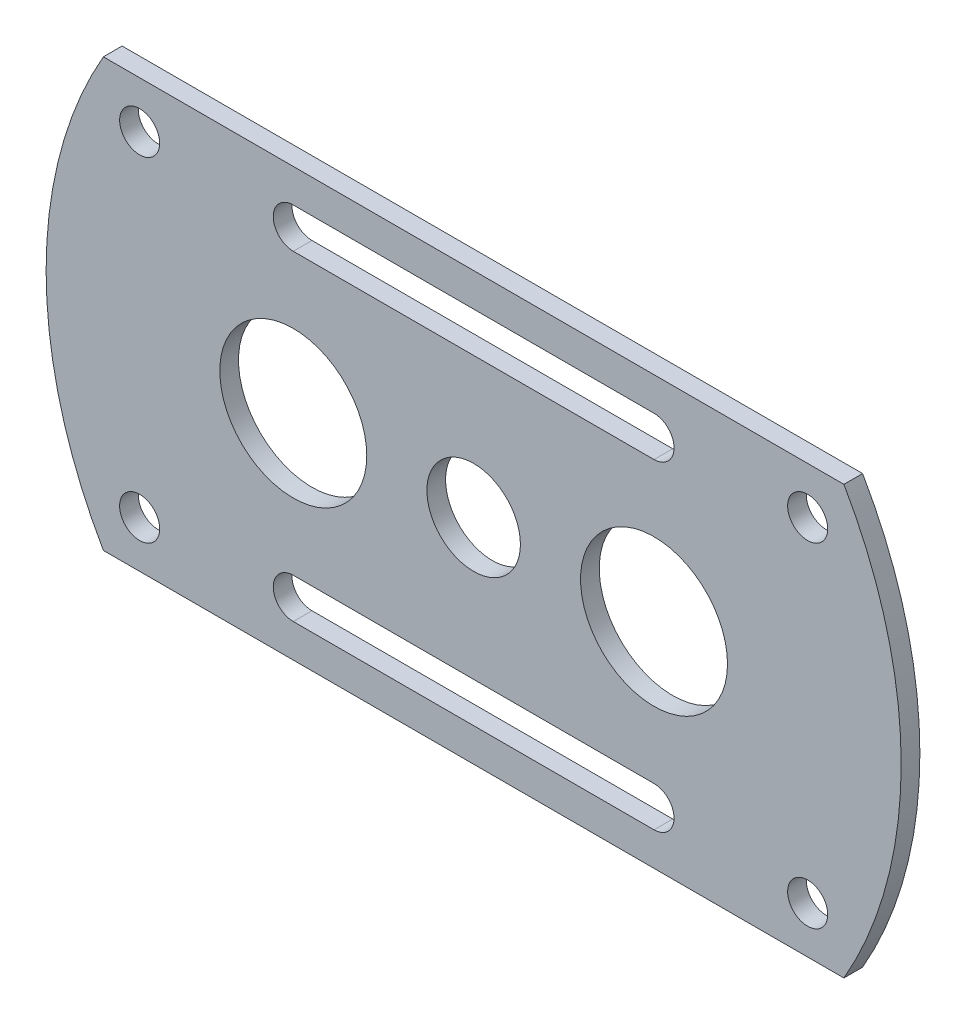
ISO-10303-21;
HEADER;
FILE_DESCRIPTION(('STEP AP214'),'2;1');
FILE_NAME('part.step','',(''),(''),'','','');
FILE_SCHEMA(('AUTOMOTIVE_DESIGN { 1 0 10303 214 1 1 1 1 }'));
ENDSEC;
DATA;
#1=APPLICATION_CONTEXT('core data for automotive mechanical design processes');
#2=APPLICATION_PROTOCOL_DEFINITION('international standard','automotive_design',2000,#1);
#3=PRODUCT_CONTEXT('',#1,'mechanical');
#4=PRODUCT('Part','Part','',(#3));
#5=PRODUCT_RELATED_PRODUCT_CATEGORY('part','',(#4));
#6=PRODUCT_DEFINITION_FORMATION('','',#4);
#7=PRODUCT_DEFINITION_CONTEXT('part definition',#1,'design');
#8=PRODUCT_DEFINITION('design','',#6,#7);
#9=PRODUCT_DEFINITION_SHAPE('','',#8);
#10=(LENGTH_UNIT() NAMED_UNIT(*) SI_UNIT(.MILLI.,.METRE.));
#11=(NAMED_UNIT(*) PLANE_ANGLE_UNIT() SI_UNIT($,.RADIAN.));
#12=(NAMED_UNIT(*) SI_UNIT($,.STERADIAN.) SOLID_ANGLE_UNIT());
#13=UNCERTAINTY_MEASURE_WITH_UNIT(LENGTH_MEASURE(1.E-05),#10,'distance_accuracy_value','');
#14=(GEOMETRIC_REPRESENTATION_CONTEXT(3) GLOBAL_UNCERTAINTY_ASSIGNED_CONTEXT((#13)) GLOBAL_UNIT_ASSIGNED_CONTEXT((#10,
#11,#12)) REPRESENTATION_CONTEXT('',''));
#15=CARTESIAN_POINT('',(0.,0.,0.));
#16=DIRECTION('',(0.,0.,1.));
#17=DIRECTION('',(1.,0.,0.));
#18=AXIS2_PLACEMENT_3D('',#15,#16,#17);
#19=CARTESIAN_POINT('',(0.,0.,1.4));
#20=DIRECTION('',(0.,0.,1.));
#21=DIRECTION('',(1.,0.,0.));
#22=AXIS2_PLACEMENT_3D('',#19,#20,#21);
#23=PLANE('',#22);
#24=CARTESIAN_POINT('',(-25.,12.5,1.4));
#25=DIRECTION('',(0.,0.,1.));
#26=DIRECTION('',(1.,0.,0.));
#27=AXIS2_PLACEMENT_3D('',#24,#25,#26);
#28=CIRCLE('',#27,1.5);
#29=CARTESIAN_POINT('',(-23.5,12.5,1.4));
#30=VERTEX_POINT('',#29);
#31=EDGE_CURVE('E202',#30,#30,#28,.F.);
#32=ORIENTED_EDGE('',*,*,#31,.T.);
#33=EDGE_LOOP('',(#32));
#34=FACE_BOUND('',#33,.T.);
#35=CARTESIAN_POINT('',(25.,12.5,1.4));
#36=DIRECTION('',(0.,0.,1.));
#37=DIRECTION('',(1.,0.,0.));
#38=AXIS2_PLACEMENT_3D('',#35,#36,#37);
#39=CIRCLE('',#38,1.5);
#40=CARTESIAN_POINT('',(26.5,12.5,1.4));
#41=VERTEX_POINT('',#40);
#42=EDGE_CURVE('E205',#41,#41,#39,.F.);
#43=ORIENTED_EDGE('',*,*,#42,.T.);
#44=EDGE_LOOP('',(#43));
#45=FACE_BOUND('',#44,.T.);
#46=CARTESIAN_POINT('',(-25.,-12.5,1.4));
#47=DIRECTION('',(0.,0.,1.));
#48=DIRECTION('',(1.,0.,0.));
#49=AXIS2_PLACEMENT_3D('',#46,#47,#48);
#50=CIRCLE('',#49,1.5);
#51=CARTESIAN_POINT('',(-23.5,-12.5,1.4));
#52=VERTEX_POINT('',#51);
#53=EDGE_CURVE('E210',#52,#52,#50,.F.);
#54=ORIENTED_EDGE('',*,*,#53,.T.);
#55=EDGE_LOOP('',(#54));
#56=FACE_BOUND('',#55,.T.);
#57=CARTESIAN_POINT('',(25.,-12.5,1.4));
#58=DIRECTION('',(0.,0.,1.));
#59=DIRECTION('',(1.,0.,0.));
#60=AXIS2_PLACEMENT_3D('',#57,#58,#59);
#61=CIRCLE('',#60,1.5);
#62=CARTESIAN_POINT('',(26.5,-12.5,1.4));
#63=VERTEX_POINT('',#62);
#64=EDGE_CURVE('E215',#63,#63,#61,.F.);
#65=ORIENTED_EDGE('',*,*,#64,.T.);
#66=EDGE_LOOP('',(#65));
#67=FACE_BOUND('',#66,.T.);
#68=CARTESIAN_POINT('',(0.,0.,1.4));
#69=DIRECTION('',(0.,0.,1.));
#70=DIRECTION('',(1.,0.,0.));
#71=AXIS2_PLACEMENT_3D('',#68,#69,#70);
#72=CIRCLE('',#71,3.5);
#73=CARTESIAN_POINT('',(3.5,0.,1.4));
#74=VERTEX_POINT('',#73);
#75=EDGE_CURVE('E220',#74,#74,#72,.F.);
#76=ORIENTED_EDGE('',*,*,#75,.T.);
#77=EDGE_LOOP('',(#76));
#78=FACE_BOUND('',#77,.T.);
#79=CARTESIAN_POINT('',(-13.5,0.,1.4));
#80=DIRECTION('',(0.,0.,1.));
#81=DIRECTION('',(1.,0.,0.));
#82=AXIS2_PLACEMENT_3D('',#79,#80,#81);
#83=CIRCLE('',#82,5.5);
#84=CARTESIAN_POINT('',(-8.,0.,1.4));
#85=VERTEX_POINT('',#84);
#86=EDGE_CURVE('E225',#85,#85,#83,.F.);
#87=ORIENTED_EDGE('',*,*,#86,.T.);
#88=EDGE_LOOP('',(#87));
#89=FACE_BOUND('',#88,.T.);
#90=CARTESIAN_POINT('',(13.5,0.,1.4));
#91=DIRECTION('',(0.,0.,1.));
#92=DIRECTION('',(1.,0.,0.));
#93=AXIS2_PLACEMENT_3D('',#90,#91,#92);
#94=CIRCLE('',#93,5.5);
#95=CARTESIAN_POINT('',(19.,0.,1.4));
#96=VERTEX_POINT('',#95);
#97=EDGE_CURVE('E135',#96,#96,#94,.F.);
#98=ORIENTED_EDGE('',*,*,#97,.T.);
#99=EDGE_LOOP('',(#98));
#100=FACE_BOUND('',#99,.T.);
#101=DIRECTION('',(-1.,0.,0.));
#102=VECTOR('',#101,1.);
#103=CARTESIAN_POINT('',(13.5,13.5,1.4));
#104=LINE('',#103,#102);
#105=CARTESIAN_POINT('',(-13.5,13.5,1.4));
#106=VERTEX_POINT('',#105);
#107=CARTESIAN_POINT('',(13.5,13.5,1.4));
#108=VERTEX_POINT('',#107);
#109=EDGE_CURVE('E136',#106,#108,#104,.F.);
#110=ORIENTED_EDGE('',*,*,#109,.T.);
#111=CARTESIAN_POINT('',(13.5,12.,1.4));
#112=DIRECTION('',(0.,0.,1.));
#113=DIRECTION('',(1.,0.,0.));
#114=AXIS2_PLACEMENT_3D('',#111,#112,#113);
#115=CIRCLE('',#114,1.5);
#116=CARTESIAN_POINT('',(13.5,10.5,1.4));
#117=VERTEX_POINT('',#116);
#118=EDGE_CURVE('E236',#108,#117,#115,.F.);
#119=ORIENTED_EDGE('',*,*,#118,.T.);
#120=DIRECTION('',(1.,0.,0.));
#121=VECTOR('',#120,1.);
#122=CARTESIAN_POINT('',(-13.5,10.5,1.4));
#123=LINE('',#122,#121);
#124=CARTESIAN_POINT('',(-13.5,10.5,1.4));
#125=VERTEX_POINT('',#124);
#126=EDGE_CURVE('E132',#117,#125,#123,.F.);
#127=ORIENTED_EDGE('',*,*,#126,.T.);
#128=CARTESIAN_POINT('',(-13.5,12.,1.4));
#129=DIRECTION('',(0.,0.,1.));
#130=DIRECTION('',(1.,0.,0.));
#131=AXIS2_PLACEMENT_3D('',#128,#129,#130);
#132=CIRCLE('',#131,1.5);
#133=EDGE_CURVE('E143',#125,#106,#132,.F.);
#134=ORIENTED_EDGE('',*,*,#133,.T.);
#135=EDGE_LOOP('',(#110,#119,#127,#134));
#136=FACE_BOUND('',#135,.T.);
#137=DIRECTION('',(1.,0.,0.));
#138=VECTOR('',#137,1.);
#139=CARTESIAN_POINT('',(-13.5,-13.5,1.4));
#140=LINE('',#139,#138);
#141=CARTESIAN_POINT('',(13.5,-13.5,1.4));
#142=VERTEX_POINT('',#141);
#143=CARTESIAN_POINT('',(-13.5,-13.5,1.4));
#144=VERTEX_POINT('',#143);
#145=EDGE_CURVE('E145',#142,#144,#140,.F.);
#146=ORIENTED_EDGE('',*,*,#145,.T.);
#147=CARTESIAN_POINT('',(-13.5,-12.,1.4));
#148=DIRECTION('',(0.,0.,1.));
#149=DIRECTION('',(1.,0.,0.));
#150=AXIS2_PLACEMENT_3D('',#147,#148,#149);
#151=CIRCLE('',#150,1.5);
#152=CARTESIAN_POINT('',(-13.5,-10.5,1.4));
#153=VERTEX_POINT('',#152);
#154=EDGE_CURVE('E240',#144,#153,#151,.F.);
#155=ORIENTED_EDGE('',*,*,#154,.T.);
#156=DIRECTION('',(-1.,0.,0.));
#157=VECTOR('',#156,1.);
#158=CARTESIAN_POINT('',(13.5,-10.5,1.4));
#159=LINE('',#158,#157);
#160=CARTESIAN_POINT('',(13.5,-10.5,1.4));
#161=VERTEX_POINT('',#160);
#162=EDGE_CURVE('E140',#153,#161,#159,.F.);
#163=ORIENTED_EDGE('',*,*,#162,.T.);
#164=CARTESIAN_POINT('',(13.5,-12.,1.4));
#165=DIRECTION('',(0.,0.,1.));
#166=DIRECTION('',(1.,0.,0.));
#167=AXIS2_PLACEMENT_3D('',#164,#165,#166);
#168=CIRCLE('',#167,1.5);
#169=EDGE_CURVE('E243',#161,#142,#168,.F.);
#170=ORIENTED_EDGE('',*,*,#169,.T.);
#171=EDGE_LOOP('',(#146,#155,#163,#170));
#172=FACE_BOUND('',#171,.T.);
#173=DIRECTION('',(1.,0.,0.));
#174=VECTOR('',#173,1.);
#175=CARTESIAN_POINT('',(-27.712812921102,-16.,1.4));
#176=LINE('',#175,#174);
#177=CARTESIAN_POINT('',(27.712812921102,-16.,1.4));
#178=VERTEX_POINT('',#177);
#179=CARTESIAN_POINT('',(-27.712812921102,-16.,1.4));
#180=VERTEX_POINT('',#179);
#181=EDGE_CURVE('E104',#178,#180,#176,.F.);
#182=ORIENTED_EDGE('',*,*,#181,.F.);
#183=CARTESIAN_POINT('',(0.,0.,1.4));
#184=DIRECTION('',(0.,0.,1.));
#185=DIRECTION('',(1.,0.,0.));
#186=AXIS2_PLACEMENT_3D('',#183,#184,#185);
#187=CIRCLE('',#186,32.);
#188=CARTESIAN_POINT('',(27.712812921102,16.,1.4));
#189=VERTEX_POINT('',#188);
#190=EDGE_CURVE('E119',#189,#178,#187,.F.);
#191=ORIENTED_EDGE('',*,*,#190,.F.);
#192=DIRECTION('',(-1.,0.,0.));
#193=VECTOR('',#192,1.);
#194=CARTESIAN_POINT('',(27.712812921102,16.,1.4));
#195=LINE('',#194,#193);
#196=CARTESIAN_POINT('',(-27.712812921102,16.,1.4));
#197=VERTEX_POINT('',#196);
#198=EDGE_CURVE('E117',#197,#189,#195,.F.);
#199=ORIENTED_EDGE('',*,*,#198,.F.);
#200=CARTESIAN_POINT('',(0.,0.,1.4));
#201=DIRECTION('',(0.,0.,1.));
#202=DIRECTION('',(1.,0.,0.));
#203=AXIS2_PLACEMENT_3D('',#200,#201,#202);
#204=CIRCLE('',#203,32.);
#205=EDGE_CURVE('E20',#180,#197,#204,.F.);
#206=ORIENTED_EDGE('',*,*,#205,.F.);
#207=EDGE_LOOP('',(#182,#191,#199,#206));
#208=FACE_BOUND('',#207,.T.);
#209=ADVANCED_FACE('F17',(#34,#45,#56,#67,#78,#89,#100,#136,#172,#208),#23,.T.);
#210=CARTESIAN_POINT('',(27.712812921102,16.,0.));
#211=DIRECTION('',(0.,1.,0.));
#212=DIRECTION('',(-1.,0.,0.));
#213=AXIS2_PLACEMENT_3D('',#210,#211,#212);
#214=PLANE('',#213);
#215=ORIENTED_EDGE('',*,*,#198,.T.);
#216=DIRECTION('',(0.,0.,1.));
#217=VECTOR('',#216,1.);
#218=CARTESIAN_POINT('',(27.712812921102,16.,0.));
#219=LINE('',#218,#217);
#220=CARTESIAN_POINT('',(27.712812921102,16.,0.));
#221=VERTEX_POINT('',#220);
#222=EDGE_CURVE('E245',#221,#189,#219,.T.);
#223=ORIENTED_EDGE('',*,*,#222,.F.);
#224=DIRECTION('',(1.,0.,0.));
#225=VECTOR('',#224,1.);
#226=CARTESIAN_POINT('',(0.,16.,0.));
#227=LINE('',#226,#225);
#228=CARTESIAN_POINT('',(-27.712812921102,16.,0.));
#229=VERTEX_POINT('',#228);
#230=EDGE_CURVE('E126',#221,#229,#227,.F.);
#231=ORIENTED_EDGE('',*,*,#230,.T.);
#232=DIRECTION('',(0.,0.,1.));
#233=VECTOR('',#232,1.);
#234=CARTESIAN_POINT('',(-27.712812921102,16.,0.));
#235=LINE('',#234,#233);
#236=EDGE_CURVE('E113',#197,#229,#235,.F.);
#237=ORIENTED_EDGE('',*,*,#236,.F.);
#238=EDGE_LOOP('',(#215,#223,#231,#237));
#239=FACE_BOUND('',#238,.T.);
#240=ADVANCED_FACE('F125',(#239),#214,.T.);
#241=CARTESIAN_POINT('',(0.,0.,0.));
#242=DIRECTION('',(0.,0.,1.));
#243=DIRECTION('',(1.,0.,0.));
#244=AXIS2_PLACEMENT_3D('',#241,#242,#243);
#245=CYLINDRICAL_SURFACE('',#244,32.);
#246=ORIENTED_EDGE('',*,*,#205,.T.);
#247=ORIENTED_EDGE('',*,*,#236,.T.);
#248=CARTESIAN_POINT('',(0.,0.,0.));
#249=DIRECTION('',(0.,0.,1.));
#250=DIRECTION('',(1.,0.,0.));
#251=AXIS2_PLACEMENT_3D('',#248,#249,#250);
#252=CIRCLE('',#251,32.);
#253=CARTESIAN_POINT('',(-27.712812921102,-16.,0.));
#254=VERTEX_POINT('',#253);
#255=EDGE_CURVE('E200',#229,#254,#252,.T.);
#256=ORIENTED_EDGE('',*,*,#255,.T.);
#257=DIRECTION('',(0.,0.,1.));
#258=VECTOR('',#257,1.);
#259=CARTESIAN_POINT('',(-27.712812921102,-16.,0.));
#260=LINE('',#259,#258);
#261=EDGE_CURVE('E115',#180,#254,#260,.F.);
#262=ORIENTED_EDGE('',*,*,#261,.F.);
#263=EDGE_LOOP('',(#246,#247,#256,#262));
#264=FACE_BOUND('',#263,.T.);
#265=ADVANCED_FACE('F110',(#264),#245,.T.);
#266=CARTESIAN_POINT('',(-27.712812921102,-16.,0.));
#267=DIRECTION('',(0.,-1.,0.));
#268=DIRECTION('',(1.,0.,0.));
#269=AXIS2_PLACEMENT_3D('',#266,#267,#268);
#270=PLANE('',#269);
#271=ORIENTED_EDGE('',*,*,#181,.T.);
#272=ORIENTED_EDGE('',*,*,#261,.T.);
#273=DIRECTION('',(1.,0.,0.));
#274=VECTOR('',#273,1.);
#275=CARTESIAN_POINT('',(0.,-16.,0.));
#276=LINE('',#275,#274);
#277=CARTESIAN_POINT('',(27.712812921102,-16.,0.));
#278=VERTEX_POINT('',#277);
#279=EDGE_CURVE('E199',#254,#278,#276,.T.);
#280=ORIENTED_EDGE('',*,*,#279,.T.);
#281=DIRECTION('',(0.,0.,1.));
#282=VECTOR('',#281,1.);
#283=CARTESIAN_POINT('',(27.712812921102,-16.,0.));
#284=LINE('',#283,#282);
#285=EDGE_CURVE('E244',#178,#278,#284,.F.);
#286=ORIENTED_EDGE('',*,*,#285,.F.);
#287=EDGE_LOOP('',(#271,#272,#280,#286));
#288=FACE_BOUND('',#287,.T.);
#289=ADVANCED_FACE('F465',(#288),#270,.T.);
#290=CARTESIAN_POINT('',(0.,0.,0.));
#291=DIRECTION('',(0.,0.,1.));
#292=DIRECTION('',(1.,0.,0.));
#293=AXIS2_PLACEMENT_3D('',#290,#291,#292);
#294=CYLINDRICAL_SURFACE('',#293,32.);
#295=ORIENTED_EDGE('',*,*,#190,.T.);
#296=ORIENTED_EDGE('',*,*,#285,.T.);
#297=CARTESIAN_POINT('',(0.,0.,0.));
#298=DIRECTION('',(0.,0.,1.));
#299=DIRECTION('',(1.,0.,0.));
#300=AXIS2_PLACEMENT_3D('',#297,#298,#299);
#301=CIRCLE('',#300,32.);
#302=EDGE_CURVE('E196',#278,#221,#301,.T.);
#303=ORIENTED_EDGE('',*,*,#302,.T.);
#304=ORIENTED_EDGE('',*,*,#222,.T.);
#305=EDGE_LOOP('',(#295,#296,#303,#304));
#306=FACE_BOUND('',#305,.T.);
#307=ADVANCED_FACE('F457',(#306),#294,.T.);
#308=CARTESIAN_POINT('',(13.5,-12.,0.));
#309=DIRECTION('',(0.,0.,1.));
#310=DIRECTION('',(1.,0.,0.));
#311=AXIS2_PLACEMENT_3D('',#308,#309,#310);
#312=CYLINDRICAL_SURFACE('',#311,1.5);
#313=DIRECTION('',(0.,0.,1.));
#314=VECTOR('',#313,1.);
#315=CARTESIAN_POINT('',(13.5,-10.5,0.));
#316=LINE('',#315,#314);
#317=CARTESIAN_POINT('',(13.5,-10.5,0.));
#318=VERTEX_POINT('',#317);
#319=EDGE_CURVE('E242',#161,#318,#316,.F.);
#320=ORIENTED_EDGE('',*,*,#319,.T.);
#321=CARTESIAN_POINT('',(13.5,-12.,0.));
#322=DIRECTION('',(0.,0.,1.));
#323=DIRECTION('',(1.,0.,0.));
#324=AXIS2_PLACEMENT_3D('',#321,#322,#323);
#325=CIRCLE('',#324,1.5);
#326=CARTESIAN_POINT('',(13.5,-13.5,0.));
#327=VERTEX_POINT('',#326);
#328=EDGE_CURVE('E193',#318,#327,#325,.F.);
#329=ORIENTED_EDGE('',*,*,#328,.T.);
#330=DIRECTION('',(0.,0.,1.));
#331=VECTOR('',#330,1.);
#332=CARTESIAN_POINT('',(13.5,-13.5,0.));
#333=LINE('',#332,#331);
#334=EDGE_CURVE('E147',#327,#142,#333,.T.);
#335=ORIENTED_EDGE('',*,*,#334,.T.);
#336=ORIENTED_EDGE('',*,*,#169,.F.);
#337=EDGE_LOOP('',(#320,#329,#335,#336));
#338=FACE_BOUND('',#337,.T.);
#339=ADVANCED_FACE('F304',(#338),#312,.F.);
#340=CARTESIAN_POINT('',(-13.5,-13.5,0.));
#341=DIRECTION('',(0.,-1.,0.));
#342=DIRECTION('',(1.,0.,0.));
#343=AXIS2_PLACEMENT_3D('',#340,#341,#342);
#344=PLANE('',#343);
#345=ORIENTED_EDGE('',*,*,#334,.F.);
#346=DIRECTION('',(1.,0.,0.));
#347=VECTOR('',#346,1.);
#348=CARTESIAN_POINT('',(0.,-13.5,0.));
#349=LINE('',#348,#347);
#350=CARTESIAN_POINT('',(-13.5,-13.5,0.));
#351=VERTEX_POINT('',#350);
#352=EDGE_CURVE('E192',#327,#351,#349,.F.);
#353=ORIENTED_EDGE('',*,*,#352,.T.);
#354=DIRECTION('',(0.,0.,1.));
#355=VECTOR('',#354,1.);
#356=CARTESIAN_POINT('',(-13.5,-13.5,0.));
#357=LINE('',#356,#355);
#358=EDGE_CURVE('E146',#351,#144,#357,.T.);
#359=ORIENTED_EDGE('',*,*,#358,.T.);
#360=ORIENTED_EDGE('',*,*,#145,.F.);
#361=EDGE_LOOP('',(#345,#353,#359,#360));
#362=FACE_BOUND('',#361,.T.);
#363=ADVANCED_FACE('F299',(#362),#344,.F.);
#364=CARTESIAN_POINT('',(-13.5,-12.,0.));
#365=DIRECTION('',(0.,0.,1.));
#366=DIRECTION('',(1.,0.,0.));
#367=AXIS2_PLACEMENT_3D('',#364,#365,#366);
#368=CYLINDRICAL_SURFACE('',#367,1.5);
#369=ORIENTED_EDGE('',*,*,#358,.F.);
#370=CARTESIAN_POINT('',(-13.5,-12.,0.));
#371=DIRECTION('',(0.,0.,1.));
#372=DIRECTION('',(1.,0.,0.));
#373=AXIS2_PLACEMENT_3D('',#370,#371,#372);
#374=CIRCLE('',#373,1.5);
#375=CARTESIAN_POINT('',(-13.5,-10.5,0.));
#376=VERTEX_POINT('',#375);
#377=EDGE_CURVE('E189',#351,#376,#374,.F.);
#378=ORIENTED_EDGE('',*,*,#377,.T.);
#379=DIRECTION('',(0.,0.,1.));
#380=VECTOR('',#379,1.);
#381=CARTESIAN_POINT('',(-13.5,-10.5,0.));
#382=LINE('',#381,#380);
#383=EDGE_CURVE('E144',#376,#153,#382,.T.);
#384=ORIENTED_EDGE('',*,*,#383,.T.);
#385=ORIENTED_EDGE('',*,*,#154,.F.);
#386=EDGE_LOOP('',(#369,#378,#384,#385));
#387=FACE_BOUND('',#386,.T.);
#388=ADVANCED_FACE('F297',(#387),#368,.F.);
#389=CARTESIAN_POINT('',(13.5,-10.5,0.));
#390=DIRECTION('',(0.,1.,0.));
#391=DIRECTION('',(-1.,0.,0.));
#392=AXIS2_PLACEMENT_3D('',#389,#390,#391);
#393=PLANE('',#392);
#394=ORIENTED_EDGE('',*,*,#383,.F.);
#395=DIRECTION('',(1.,0.,0.));
#396=VECTOR('',#395,1.);
#397=CARTESIAN_POINT('',(0.,-10.5,0.));
#398=LINE('',#397,#396);
#399=EDGE_CURVE('E188',#376,#318,#398,.T.);
#400=ORIENTED_EDGE('',*,*,#399,.T.);
#401=ORIENTED_EDGE('',*,*,#319,.F.);
#402=ORIENTED_EDGE('',*,*,#162,.F.);
#403=EDGE_LOOP('',(#394,#400,#401,#402));
#404=FACE_BOUND('',#403,.T.);
#405=ADVANCED_FACE('F307',(#404),#393,.F.);
#406=CARTESIAN_POINT('',(-13.5,12.,0.));
#407=DIRECTION('',(0.,0.,1.));
#408=DIRECTION('',(1.,0.,0.));
#409=AXIS2_PLACEMENT_3D('',#406,#407,#408);
#410=CYLINDRICAL_SURFACE('',#409,1.5);
#411=DIRECTION('',(0.,0.,1.));
#412=VECTOR('',#411,1.);
#413=CARTESIAN_POINT('',(-13.5,10.5,0.));
#414=LINE('',#413,#412);
#415=CARTESIAN_POINT('',(-13.5,10.5,0.));
#416=VERTEX_POINT('',#415);
#417=EDGE_CURVE('E238',#125,#416,#414,.F.);
#418=ORIENTED_EDGE('',*,*,#417,.T.);
#419=CARTESIAN_POINT('',(-13.5,12.,0.));
#420=DIRECTION('',(0.,0.,1.));
#421=DIRECTION('',(1.,0.,0.));
#422=AXIS2_PLACEMENT_3D('',#419,#420,#421);
#423=CIRCLE('',#422,1.5);
#424=CARTESIAN_POINT('',(-13.5,13.5,0.));
#425=VERTEX_POINT('',#424);
#426=EDGE_CURVE('E185',#416,#425,#423,.F.);
#427=ORIENTED_EDGE('',*,*,#426,.T.);
#428=DIRECTION('',(0.,0.,1.));
#429=VECTOR('',#428,1.);
#430=CARTESIAN_POINT('',(-13.5,13.5,0.));
#431=LINE('',#430,#429);
#432=EDGE_CURVE('E139',#425,#106,#431,.T.);
#433=ORIENTED_EDGE('',*,*,#432,.T.);
#434=ORIENTED_EDGE('',*,*,#133,.F.);
#435=EDGE_LOOP('',(#418,#427,#433,#434));
#436=FACE_BOUND('',#435,.T.);
#437=ADVANCED_FACE('F287',(#436),#410,.F.);
#438=CARTESIAN_POINT('',(13.5,13.5,0.));
#439=DIRECTION('',(0.,1.,0.));
#440=DIRECTION('',(-1.,0.,0.));
#441=AXIS2_PLACEMENT_3D('',#438,#439,#440);
#442=PLANE('',#441);
#443=ORIENTED_EDGE('',*,*,#432,.F.);
#444=DIRECTION('',(1.,0.,0.));
#445=VECTOR('',#444,1.);
#446=CARTESIAN_POINT('',(0.,13.5,0.));
#447=LINE('',#446,#445);
#448=CARTESIAN_POINT('',(13.5,13.5,0.));
#449=VERTEX_POINT('',#448);
#450=EDGE_CURVE('E184',#425,#449,#447,.T.);
#451=ORIENTED_EDGE('',*,*,#450,.T.);
#452=DIRECTION('',(0.,0.,1.));
#453=VECTOR('',#452,1.);
#454=CARTESIAN_POINT('',(13.5,13.5,0.));
#455=LINE('',#454,#453);
#456=EDGE_CURVE('E138',#449,#108,#455,.T.);
#457=ORIENTED_EDGE('',*,*,#456,.T.);
#458=ORIENTED_EDGE('',*,*,#109,.F.);
#459=EDGE_LOOP('',(#443,#451,#457,#458));
#460=FACE_BOUND('',#459,.T.);
#461=ADVANCED_FACE('F285',(#460),#442,.F.);
#462=CARTESIAN_POINT('',(13.5,12.,0.));
#463=DIRECTION('',(0.,0.,1.));
#464=DIRECTION('',(1.,0.,0.));
#465=AXIS2_PLACEMENT_3D('',#462,#463,#464);
#466=CYLINDRICAL_SURFACE('',#465,1.5);
#467=ORIENTED_EDGE('',*,*,#456,.F.);
#468=CARTESIAN_POINT('',(13.5,12.,0.));
#469=DIRECTION('',(0.,0.,1.));
#470=DIRECTION('',(1.,0.,0.));
#471=AXIS2_PLACEMENT_3D('',#468,#469,#470);
#472=CIRCLE('',#471,1.5);
#473=CARTESIAN_POINT('',(13.5,10.5,0.));
#474=VERTEX_POINT('',#473);
#475=EDGE_CURVE('E181',#449,#474,#472,.F.);
#476=ORIENTED_EDGE('',*,*,#475,.T.);
#477=DIRECTION('',(0.,0.,1.));
#478=VECTOR('',#477,1.);
#479=CARTESIAN_POINT('',(13.5,10.5,0.));
#480=LINE('',#479,#478);
#481=EDGE_CURVE('E35',#474,#117,#480,.T.);
#482=ORIENTED_EDGE('',*,*,#481,.T.);
#483=ORIENTED_EDGE('',*,*,#118,.F.);
#484=EDGE_LOOP('',(#467,#476,#482,#483));
#485=FACE_BOUND('',#484,.T.);
#486=ADVANCED_FACE('F281',(#485),#466,.F.);
#487=CARTESIAN_POINT('',(-13.5,10.5,0.));
#488=DIRECTION('',(0.,-1.,0.));
#489=DIRECTION('',(1.,0.,0.));
#490=AXIS2_PLACEMENT_3D('',#487,#488,#489);
#491=PLANE('',#490);
#492=ORIENTED_EDGE('',*,*,#481,.F.);
#493=DIRECTION('',(1.,0.,0.));
#494=VECTOR('',#493,1.);
#495=CARTESIAN_POINT('',(0.,10.5,0.));
#496=LINE('',#495,#494);
#497=EDGE_CURVE('E178',#474,#416,#496,.F.);
#498=ORIENTED_EDGE('',*,*,#497,.T.);
#499=ORIENTED_EDGE('',*,*,#417,.F.);
#500=ORIENTED_EDGE('',*,*,#126,.F.);
#501=EDGE_LOOP('',(#492,#498,#499,#500));
#502=FACE_BOUND('',#501,.T.);
#503=ADVANCED_FACE('F274',(#502),#491,.F.);
#504=CARTESIAN_POINT('',(13.5,0.,0.));
#505=DIRECTION('',(0.,0.,1.));
#506=DIRECTION('',(1.,0.,0.));
#507=AXIS2_PLACEMENT_3D('',#504,#505,#506);
#508=CYLINDRICAL_SURFACE('',#507,5.5);
#509=CARTESIAN_POINT('',(13.5,0.,0.));
#510=DIRECTION('',(0.,0.,1.));
#511=DIRECTION('',(1.,0.,0.));
#512=AXIS2_PLACEMENT_3D('',#509,#510,#511);
#513=CIRCLE('',#512,5.5);
#514=CARTESIAN_POINT('',(19.,0.,0.));
#515=VERTEX_POINT('',#514);
#516=EDGE_CURVE('E173',#515,#515,#513,.F.);
#517=ORIENTED_EDGE('',*,*,#516,.T.);
#518=EDGE_LOOP('',(#517));
#519=FACE_BOUND('',#518,.T.);
#520=ORIENTED_EDGE('',*,*,#97,.F.);
#521=EDGE_LOOP('',(#520));
#522=FACE_BOUND('',#521,.T.);
#523=ADVANCED_FACE('F348',(#519,#522),#508,.F.);
#524=CARTESIAN_POINT('',(-13.5,0.,0.));
#525=DIRECTION('',(0.,0.,1.));
#526=DIRECTION('',(1.,0.,0.));
#527=AXIS2_PLACEMENT_3D('',#524,#525,#526);
#528=CYLINDRICAL_SURFACE('',#527,5.5);
#529=CARTESIAN_POINT('',(-13.5,0.,0.));
#530=DIRECTION('',(0.,0.,1.));
#531=DIRECTION('',(1.,0.,0.));
#532=AXIS2_PLACEMENT_3D('',#529,#530,#531);
#533=CIRCLE('',#532,5.5);
#534=CARTESIAN_POINT('',(-8.,0.,0.));
#535=VERTEX_POINT('',#534);
#536=EDGE_CURVE('E168',#535,#535,#533,.F.);
#537=ORIENTED_EDGE('',*,*,#536,.T.);
#538=EDGE_LOOP('',(#537));
#539=FACE_BOUND('',#538,.T.);
#540=ORIENTED_EDGE('',*,*,#86,.F.);
#541=EDGE_LOOP('',(#540));
#542=FACE_BOUND('',#541,.T.);
#543=ADVANCED_FACE('F344',(#539,#542),#528,.F.);
#544=CARTESIAN_POINT('',(0.,0.,0.));
#545=DIRECTION('',(0.,0.,1.));
#546=DIRECTION('',(1.,0.,0.));
#547=AXIS2_PLACEMENT_3D('',#544,#545,#546);
#548=CYLINDRICAL_SURFACE('',#547,3.5);
#549=CARTESIAN_POINT('',(0.,0.,0.));
#550=DIRECTION('',(0.,0.,1.));
#551=DIRECTION('',(1.,0.,0.));
#552=AXIS2_PLACEMENT_3D('',#549,#550,#551);
#553=CIRCLE('',#552,3.5);
#554=CARTESIAN_POINT('',(3.5,0.,0.));
#555=VERTEX_POINT('',#554);
#556=EDGE_CURVE('E163',#555,#555,#553,.F.);
#557=ORIENTED_EDGE('',*,*,#556,.T.);
#558=EDGE_LOOP('',(#557));
#559=FACE_BOUND('',#558,.T.);
#560=ORIENTED_EDGE('',*,*,#75,.F.);
#561=EDGE_LOOP('',(#560));
#562=FACE_BOUND('',#561,.T.);
#563=ADVANCED_FACE('F340',(#559,#562),#548,.F.);
#564=CARTESIAN_POINT('',(25.,-12.5,0.));
#565=DIRECTION('',(0.,0.,1.));
#566=DIRECTION('',(1.,0.,0.));
#567=AXIS2_PLACEMENT_3D('',#564,#565,#566);
#568=CYLINDRICAL_SURFACE('',#567,1.5);
#569=CARTESIAN_POINT('',(25.,-12.5,0.));
#570=DIRECTION('',(0.,0.,1.));
#571=DIRECTION('',(1.,0.,0.));
#572=AXIS2_PLACEMENT_3D('',#569,#570,#571);
#573=CIRCLE('',#572,1.5);
#574=CARTESIAN_POINT('',(26.5,-12.5,0.));
#575=VERTEX_POINT('',#574);
#576=EDGE_CURVE('E158',#575,#575,#573,.F.);
#577=ORIENTED_EDGE('',*,*,#576,.T.);
#578=EDGE_LOOP('',(#577));
#579=FACE_BOUND('',#578,.T.);
#580=ORIENTED_EDGE('',*,*,#64,.F.);
#581=EDGE_LOOP('',(#580));
#582=FACE_BOUND('',#581,.T.);
#583=ADVANCED_FACE('F336',(#579,#582),#568,.F.);
#584=CARTESIAN_POINT('',(-25.,-12.5,0.));
#585=DIRECTION('',(0.,0.,1.));
#586=DIRECTION('',(1.,0.,0.));
#587=AXIS2_PLACEMENT_3D('',#584,#585,#586);
#588=CYLINDRICAL_SURFACE('',#587,1.5);
#589=CARTESIAN_POINT('',(-25.,-12.5,0.));
#590=DIRECTION('',(0.,0.,1.));
#591=DIRECTION('',(1.,0.,0.));
#592=AXIS2_PLACEMENT_3D('',#589,#590,#591);
#593=CIRCLE('',#592,1.5);
#594=CARTESIAN_POINT('',(-23.5,-12.5,0.));
#595=VERTEX_POINT('',#594);
#596=EDGE_CURVE('E153',#595,#595,#593,.F.);
#597=ORIENTED_EDGE('',*,*,#596,.T.);
#598=EDGE_LOOP('',(#597));
#599=FACE_BOUND('',#598,.T.);
#600=ORIENTED_EDGE('',*,*,#53,.F.);
#601=EDGE_LOOP('',(#600));
#602=FACE_BOUND('',#601,.T.);
#603=ADVANCED_FACE('F332',(#599,#602),#588,.F.);
#604=CARTESIAN_POINT('',(25.,12.5,0.));
#605=DIRECTION('',(0.,0.,1.));
#606=DIRECTION('',(1.,0.,0.));
#607=AXIS2_PLACEMENT_3D('',#604,#605,#606);
#608=CYLINDRICAL_SURFACE('',#607,1.5);
#609=CARTESIAN_POINT('',(25.,12.5,0.));
#610=DIRECTION('',(0.,0.,1.));
#611=DIRECTION('',(1.,0.,0.));
#612=AXIS2_PLACEMENT_3D('',#609,#610,#611);
#613=CIRCLE('',#612,1.5);
#614=CARTESIAN_POINT('',(26.5,12.5,0.));
#615=VERTEX_POINT('',#614);
#616=EDGE_CURVE('E26',#615,#615,#613,.F.);
#617=ORIENTED_EDGE('',*,*,#616,.T.);
#618=EDGE_LOOP('',(#617));
#619=FACE_BOUND('',#618,.T.);
#620=ORIENTED_EDGE('',*,*,#42,.F.);
#621=EDGE_LOOP('',(#620));
#622=FACE_BOUND('',#621,.T.);
#623=ADVANCED_FACE('F324',(#619,#622),#608,.F.);
#624=CARTESIAN_POINT('',(-25.,12.5,0.));
#625=DIRECTION('',(0.,0.,1.));
#626=DIRECTION('',(1.,0.,0.));
#627=AXIS2_PLACEMENT_3D('',#624,#625,#626);
#628=CYLINDRICAL_SURFACE('',#627,1.5);
#629=CARTESIAN_POINT('',(-25.,12.5,0.));
#630=DIRECTION('',(0.,0.,1.));
#631=DIRECTION('',(1.,0.,0.));
#632=AXIS2_PLACEMENT_3D('',#629,#630,#631);
#633=CIRCLE('',#632,1.5);
#634=CARTESIAN_POINT('',(-23.5,12.5,0.));
#635=VERTEX_POINT('',#634);
#636=EDGE_CURVE('E11',#635,#635,#633,.F.);
#637=ORIENTED_EDGE('',*,*,#636,.T.);
#638=EDGE_LOOP('',(#637));
#639=FACE_BOUND('',#638,.T.);
#640=ORIENTED_EDGE('',*,*,#31,.F.);
#641=EDGE_LOOP('',(#640));
#642=FACE_BOUND('',#641,.T.);
#643=ADVANCED_FACE('F318',(#639,#642),#628,.F.);
#644=CARTESIAN_POINT('',(0.,0.,0.));
#645=DIRECTION('',(0.,0.,1.));
#646=DIRECTION('',(1.,0.,0.));
#647=AXIS2_PLACEMENT_3D('',#644,#645,#646);
#648=PLANE('',#647);
#649=ORIENTED_EDGE('',*,*,#636,.F.);
#650=EDGE_LOOP('',(#649));
#651=FACE_BOUND('',#650,.T.);
#652=ORIENTED_EDGE('',*,*,#616,.F.);
#653=EDGE_LOOP('',(#652));
#654=FACE_BOUND('',#653,.T.);
#655=ORIENTED_EDGE('',*,*,#596,.F.);
#656=EDGE_LOOP('',(#655));
#657=FACE_BOUND('',#656,.T.);
#658=ORIENTED_EDGE('',*,*,#576,.F.);
#659=EDGE_LOOP('',(#658));
#660=FACE_BOUND('',#659,.T.);
#661=ORIENTED_EDGE('',*,*,#556,.F.);
#662=EDGE_LOOP('',(#661));
#663=FACE_BOUND('',#662,.T.);
#664=ORIENTED_EDGE('',*,*,#536,.F.);
#665=EDGE_LOOP('',(#664));
#666=FACE_BOUND('',#665,.T.);
#667=ORIENTED_EDGE('',*,*,#516,.F.);
#668=EDGE_LOOP('',(#667));
#669=FACE_BOUND('',#668,.T.);
#670=ORIENTED_EDGE('',*,*,#475,.F.);
#671=ORIENTED_EDGE('',*,*,#450,.F.);
#672=ORIENTED_EDGE('',*,*,#426,.F.);
#673=ORIENTED_EDGE('',*,*,#497,.F.);
#674=EDGE_LOOP('',(#670,#671,#672,#673));
#675=FACE_BOUND('',#674,.T.);
#676=ORIENTED_EDGE('',*,*,#377,.F.);
#677=ORIENTED_EDGE('',*,*,#352,.F.);
#678=ORIENTED_EDGE('',*,*,#328,.F.);
#679=ORIENTED_EDGE('',*,*,#399,.F.);
#680=EDGE_LOOP('',(#676,#677,#678,#679));
#681=FACE_BOUND('',#680,.T.);
#682=ORIENTED_EDGE('',*,*,#279,.F.);
#683=ORIENTED_EDGE('',*,*,#255,.F.);
#684=ORIENTED_EDGE('',*,*,#230,.F.);
#685=ORIENTED_EDGE('',*,*,#302,.F.);
#686=EDGE_LOOP('',(#682,#683,#684,#685));
#687=FACE_BOUND('',#686,.T.);
#688=ADVANCED_FACE('F277',(#651,#654,#657,#660,#663,#666,#669,#675,#681,#687),#648,.F.);
#689=CLOSED_SHELL('',(#209,#240,#265,#289,#307,#339,#363,#388,#405,#437,#461,#486,#503,#523,
#543,#563,#583,#603,#623,#643,#688));
#690=MANIFOLD_SOLID_BREP('B1',#689);
#691=ADVANCED_BREP_SHAPE_REPRESENTATION('',(#18,#690),#14);
#692=SHAPE_DEFINITION_REPRESENTATION(#9,#691);
ENDSEC;
END-ISO-10303-21;
